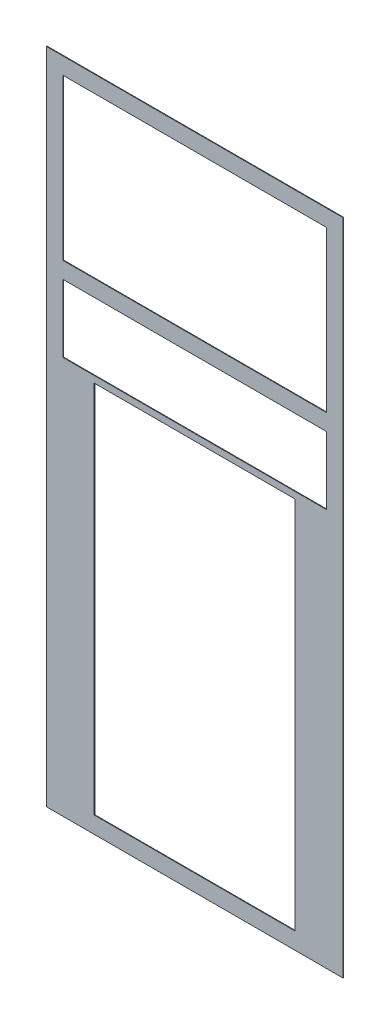
ISO-10303-21;
HEADER;
FILE_DESCRIPTION(('STEP AP214'),'2;1');
FILE_NAME('part.step','',(''),(''),'','','');
FILE_SCHEMA(('AUTOMOTIVE_DESIGN { 1 0 10303 214 1 1 1 1 }'));
ENDSEC;
DATA;
#1=APPLICATION_CONTEXT('core data for automotive mechanical design processes');
#2=APPLICATION_PROTOCOL_DEFINITION('international standard','automotive_design',2000,#1);
#3=PRODUCT_CONTEXT('',#1,'mechanical');
#4=PRODUCT('Part','Part','',(#3));
#5=PRODUCT_RELATED_PRODUCT_CATEGORY('part','',(#4));
#6=PRODUCT_DEFINITION_FORMATION('','',#4);
#7=PRODUCT_DEFINITION_CONTEXT('part definition',#1,'design');
#8=PRODUCT_DEFINITION('design','',#6,#7);
#9=PRODUCT_DEFINITION_SHAPE('','',#8);
#10=(LENGTH_UNIT() NAMED_UNIT(*) SI_UNIT(.MILLI.,.METRE.));
#11=(NAMED_UNIT(*) PLANE_ANGLE_UNIT() SI_UNIT($,.RADIAN.));
#12=(NAMED_UNIT(*) SI_UNIT($,.STERADIAN.) SOLID_ANGLE_UNIT());
#13=UNCERTAINTY_MEASURE_WITH_UNIT(LENGTH_MEASURE(1.E-05),#10,'distance_accuracy_value','');
#14=(GEOMETRIC_REPRESENTATION_CONTEXT(3) GLOBAL_UNCERTAINTY_ASSIGNED_CONTEXT((#13)) GLOBAL_UNIT_ASSIGNED_CONTEXT((#10,
#11,#12)) REPRESENTATION_CONTEXT('',''));
#15=CARTESIAN_POINT('',(0.,0.,0.));
#16=DIRECTION('',(0.,0.,1.));
#17=DIRECTION('',(1.,0.,0.));
#18=AXIS2_PLACEMENT_3D('',#15,#16,#17);
#19=CARTESIAN_POINT('',(0.,0.,1.9));
#20=DIRECTION('',(0.,0.,-1.));
#21=DIRECTION('',(-1.,0.,0.));
#22=AXIS2_PLACEMENT_3D('',#19,#20,#21);
#23=PLANE('',#22);
#24=DIRECTION('',(1.16461858888433E-12,1.,0.));
#25=VECTOR('',#24,1.);
#26=CARTESIAN_POINT('',(-50.8000000022684,5.91626243179657E-11,1.9));
#27=LINE('',#26,#25);
#28=CARTESIAN_POINT('',(-50.800000000284,1460.8,1.9));
#29=VERTEX_POINT('',#28);
#30=CARTESIAN_POINT('',(-50.8000000000007,1947.19999999995,1.9));
#31=VERTEX_POINT('',#30);
#32=EDGE_CURVE('E157',#29,#31,#27,.T.);
#33=ORIENTED_EDGE('',*,*,#32,.F.);
#34=DIRECTION('',(-1.,0.,0.));
#35=VECTOR('',#34,1.);
#36=CARTESIAN_POINT('',(-900.,1460.8,1.9));
#37=LINE('',#36,#35);
#38=CARTESIAN_POINT('',(-849.200000000284,1460.8,1.9));
#39=VERTEX_POINT('',#38);
#40=EDGE_CURVE('E165',#29,#39,#37,.T.);
#41=ORIENTED_EDGE('',*,*,#40,.T.);
#42=DIRECTION('',(-1.1643190067051E-12,-1.,0.));
#43=VECTOR('',#42,1.);
#44=CARTESIAN_POINT('',(-849.200000002268,9.88739700496609E-10,1.9));
#45=LINE('',#44,#43);
#46=CARTESIAN_POINT('',(-849.200000000001,1947.19999999995,1.9));
#47=VERTEX_POINT('',#46);
#48=EDGE_CURVE('E150',#47,#39,#45,.T.);
#49=ORIENTED_EDGE('',*,*,#48,.F.);
#50=DIRECTION('',(-1.,0.,0.));
#51=VECTOR('',#50,1.);
#52=CARTESIAN_POINT('',(-9.20617401060893E-12,1947.19999999995,1.9));
#53=LINE('',#52,#51);
#54=EDGE_CURVE('E163',#31,#47,#53,.T.);
#55=ORIENTED_EDGE('',*,*,#54,.F.);
#56=EDGE_LOOP('',(#33,#41,#49,#55));
#57=FACE_BOUND('',#56,.T.);
#58=DIRECTION('',(0.,-1.,0.));
#59=VECTOR('',#58,1.);
#60=CARTESIAN_POINT('',(-850.,1425.8,1.9));
#61=LINE('',#60,#59);
#62=CARTESIAN_POINT('',(-850.,1410.9,1.9));
#63=VERTEX_POINT('',#62);
#64=CARTESIAN_POINT('',(-850.,1205.8,1.9));
#65=VERTEX_POINT('',#64);
#66=EDGE_CURVE('E226',#63,#65,#61,.T.);
#67=ORIENTED_EDGE('',*,*,#66,.F.);
#68=DIRECTION('',(1.,0.,0.));
#69=VECTOR('',#68,1.);
#70=CARTESIAN_POINT('',(-850.,1410.9,1.9));
#71=LINE('',#70,#69);
#72=CARTESIAN_POINT('',(-49.9999999999997,1410.9,1.9));
#73=VERTEX_POINT('',#72);
#74=EDGE_CURVE('E185',#63,#73,#71,.T.);
#75=ORIENTED_EDGE('',*,*,#74,.T.);
#76=DIRECTION('',(0.,1.,0.));
#77=VECTOR('',#76,1.);
#78=CARTESIAN_POINT('',(-49.9999999999997,1425.8,1.9));
#79=LINE('',#78,#77);
#80=CARTESIAN_POINT('',(-49.9999999999996,1205.8,1.9));
#81=VERTEX_POINT('',#80);
#82=EDGE_CURVE('E212',#81,#73,#79,.T.);
#83=ORIENTED_EDGE('',*,*,#82,.F.);
#84=DIRECTION('',(1.,0.,0.));
#85=VECTOR('',#84,1.);
#86=CARTESIAN_POINT('',(-850.,1205.8,1.9));
#87=LINE('',#86,#85);
#88=EDGE_CURVE('E219',#65,#81,#87,.T.);
#89=ORIENTED_EDGE('',*,*,#88,.F.);
#90=EDGE_LOOP('',(#67,#75,#83,#89));
#91=FACE_BOUND('',#90,.T.);
#92=DIRECTION('',(0.,1.,0.));
#93=VECTOR('',#92,1.);
#94=CARTESIAN_POINT('',(-1.11022302462516E-13,1190.8,1.9));
#95=LINE('',#94,#93);
#96=CARTESIAN_POINT('',(0.,0.,1.9));
#97=VERTEX_POINT('',#96);
#98=CARTESIAN_POINT('',(-4.99600362136823E-13,1997.99999999995,1.9));
#99=VERTEX_POINT('',#98);
#100=EDGE_CURVE('E256',#97,#99,#95,.T.);
#101=ORIENTED_EDGE('',*,*,#100,.T.);
#102=DIRECTION('',(1.,0.,0.));
#103=VECTOR('',#102,1.);
#104=CARTESIAN_POINT('',(-5.12656583850879E-11,1997.99999999995,1.9));
#105=LINE('',#104,#103);
#106=CARTESIAN_POINT('',(-900.000000000036,1997.99999999993,1.9));
#107=VERTEX_POINT('',#106);
#108=EDGE_CURVE('E166',#107,#99,#105,.T.);
#109=ORIENTED_EDGE('',*,*,#108,.F.);
#110=DIRECTION('',(0.,-1.,0.));
#111=VECTOR('',#110,1.);
#112=CARTESIAN_POINT('',(-900.,-1.11022302462516E-13,1.9));
#113=LINE('',#112,#111);
#114=CARTESIAN_POINT('',(-900.,-1.11022302462516E-13,1.9));
#115=VERTEX_POINT('',#114);
#116=EDGE_CURVE('E258',#107,#115,#113,.T.);
#117=ORIENTED_EDGE('',*,*,#116,.T.);
#118=DIRECTION('',(1.,0.,0.));
#119=VECTOR('',#118,1.);
#120=CARTESIAN_POINT('',(0.,0.,1.9));
#121=LINE('',#120,#119);
#122=EDGE_CURVE('E261',#115,#97,#121,.T.);
#123=ORIENTED_EDGE('',*,*,#122,.T.);
#124=EDGE_LOOP('',(#101,#109,#117,#123));
#125=FACE_BOUND('',#124,.T.);
#126=DIRECTION('',(0.,-1.,0.));
#127=VECTOR('',#126,1.);
#128=CARTESIAN_POINT('',(-755.,50.8000000000033,1.9));
#129=LINE('',#128,#127);
#130=CARTESIAN_POINT('',(-755.,1185.8,1.9));
#131=VERTEX_POINT('',#130);
#132=CARTESIAN_POINT('',(-755.,50.8000000000033,1.9));
#133=VERTEX_POINT('',#132);
#134=EDGE_CURVE('E237',#131,#133,#129,.T.);
#135=ORIENTED_EDGE('',*,*,#134,.F.);
#136=DIRECTION('',(-1.,0.,0.));
#137=VECTOR('',#136,1.);
#138=CARTESIAN_POINT('',(-755.,1185.8,1.9));
#139=LINE('',#138,#137);
#140=CARTESIAN_POINT('',(-145.,1185.8,1.9));
#141=VERTEX_POINT('',#140);
#142=EDGE_CURVE('E204',#141,#131,#139,.T.);
#143=ORIENTED_EDGE('',*,*,#142,.F.);
#144=DIRECTION('',(0.,1.,0.));
#145=VECTOR('',#144,1.);
#146=CARTESIAN_POINT('',(-145.,1170.8,1.9));
#147=LINE('',#146,#145);
#148=CARTESIAN_POINT('',(-145.,50.8000000000034,1.9));
#149=VERTEX_POINT('',#148);
#150=EDGE_CURVE('E242',#149,#141,#147,.T.);
#151=ORIENTED_EDGE('',*,*,#150,.F.);
#152=DIRECTION('',(1.,0.,0.));
#153=VECTOR('',#152,1.);
#154=CARTESIAN_POINT('',(-145.,50.8000000000034,1.9));
#155=LINE('',#154,#153);
#156=EDGE_CURVE('E239',#133,#149,#155,.T.);
#157=ORIENTED_EDGE('',*,*,#156,.F.);
#158=EDGE_LOOP('',(#135,#143,#151,#157));
#159=FACE_BOUND('',#158,.T.);
#160=ADVANCED_FACE('F36',(#57,#91,#125,#159),#23,.F.);
#161=CARTESIAN_POINT('',(0.,0.,0.));
#162=DIRECTION('',(0.,0.,-1.));
#163=DIRECTION('',(-1.,0.,0.));
#164=AXIS2_PLACEMENT_3D('',#161,#162,#163);
#165=PLANE('',#164);
#166=DIRECTION('',(-1.,0.,0.));
#167=VECTOR('',#166,1.);
#168=CARTESIAN_POINT('',(-900.,1460.8,0.));
#169=LINE('',#168,#167);
#170=CARTESIAN_POINT('',(-50.8000000005671,1460.8,0.));
#171=VERTEX_POINT('',#170);
#172=CARTESIAN_POINT('',(-849.200000000142,1460.8,0.));
#173=VERTEX_POINT('',#172);
#174=EDGE_CURVE('E51',#171,#173,#169,.T.);
#175=ORIENTED_EDGE('',*,*,#174,.F.);
#176=DIRECTION('',(1.16461858888433E-12,1.,0.));
#177=VECTOR('',#176,1.);
#178=CARTESIAN_POINT('',(-50.8000000022684,5.91626243179657E-11,0.));
#179=LINE('',#178,#177);
#180=CARTESIAN_POINT('',(-50.8000000000007,1947.19999999995,0.));
#181=VERTEX_POINT('',#180);
#182=EDGE_CURVE('E170',#171,#181,#179,.T.);
#183=ORIENTED_EDGE('',*,*,#182,.T.);
#184=DIRECTION('',(-1.,0.,0.));
#185=VECTOR('',#184,1.);
#186=CARTESIAN_POINT('',(-9.20617401060893E-12,1947.19999999995,0.));
#187=LINE('',#186,#185);
#188=CARTESIAN_POINT('',(-849.200000000001,1947.19999999995,0.));
#189=VERTEX_POINT('',#188);
#190=EDGE_CURVE('E179',#181,#189,#187,.T.);
#191=ORIENTED_EDGE('',*,*,#190,.T.);
#192=DIRECTION('',(-1.1643190067051E-12,-1.,0.));
#193=VECTOR('',#192,1.);
#194=CARTESIAN_POINT('',(-849.200000002268,9.88739700496609E-10,0.));
#195=LINE('',#194,#193);
#196=EDGE_CURVE('E152',#189,#173,#195,.T.);
#197=ORIENTED_EDGE('',*,*,#196,.T.);
#198=EDGE_LOOP('',(#175,#183,#191,#197));
#199=FACE_BOUND('',#198,.T.);
#200=DIRECTION('',(1.,0.,0.));
#201=VECTOR('',#200,1.);
#202=CARTESIAN_POINT('',(-850.,1410.9,0.));
#203=LINE('',#202,#201);
#204=CARTESIAN_POINT('',(-850.,1410.9,0.));
#205=VERTEX_POINT('',#204);
#206=CARTESIAN_POINT('',(-49.9999999999997,1410.9,0.));
#207=VERTEX_POINT('',#206);
#208=EDGE_CURVE('E195',#205,#207,#203,.T.);
#209=ORIENTED_EDGE('',*,*,#208,.F.);
#210=DIRECTION('',(0.,-1.,0.));
#211=VECTOR('',#210,1.);
#212=CARTESIAN_POINT('',(-850.,1425.8,0.));
#213=LINE('',#212,#211);
#214=CARTESIAN_POINT('',(-850.,1205.8,0.));
#215=VERTEX_POINT('',#214);
#216=EDGE_CURVE('E218',#205,#215,#213,.T.);
#217=ORIENTED_EDGE('',*,*,#216,.T.);
#218=DIRECTION('',(1.,0.,0.));
#219=VECTOR('',#218,1.);
#220=CARTESIAN_POINT('',(-850.,1205.8,0.));
#221=LINE('',#220,#219);
#222=CARTESIAN_POINT('',(-49.9999999999996,1205.8,0.));
#223=VERTEX_POINT('',#222);
#224=EDGE_CURVE('E221',#215,#223,#221,.T.);
#225=ORIENTED_EDGE('',*,*,#224,.T.);
#226=DIRECTION('',(0.,1.,0.));
#227=VECTOR('',#226,1.);
#228=CARTESIAN_POINT('',(-49.9999999999997,1425.8,0.));
#229=LINE('',#228,#227);
#230=EDGE_CURVE('E215',#223,#207,#229,.T.);
#231=ORIENTED_EDGE('',*,*,#230,.T.);
#232=EDGE_LOOP('',(#209,#217,#225,#231));
#233=FACE_BOUND('',#232,.T.);
#234=DIRECTION('',(1.,0.,0.));
#235=VECTOR('',#234,1.);
#236=CARTESIAN_POINT('',(0.,1185.8,0.));
#237=LINE('',#236,#235);
#238=CARTESIAN_POINT('',(-755.,1185.8,0.));
#239=VERTEX_POINT('',#238);
#240=CARTESIAN_POINT('',(-145.,1185.8,0.));
#241=VERTEX_POINT('',#240);
#242=EDGE_CURVE('E11',#239,#241,#237,.T.);
#243=ORIENTED_EDGE('',*,*,#242,.F.);
#244=DIRECTION('',(0.,-1.,0.));
#245=VECTOR('',#244,1.);
#246=CARTESIAN_POINT('',(-755.,50.8000000000033,0.));
#247=LINE('',#246,#245);
#248=CARTESIAN_POINT('',(-755.,50.8000000000033,0.));
#249=VERTEX_POINT('',#248);
#250=EDGE_CURVE('E235',#239,#249,#247,.T.);
#251=ORIENTED_EDGE('',*,*,#250,.T.);
#252=DIRECTION('',(1.,0.,0.));
#253=VECTOR('',#252,1.);
#254=CARTESIAN_POINT('',(-145.,50.8000000000034,0.));
#255=LINE('',#254,#253);
#256=CARTESIAN_POINT('',(-145.,50.8000000000034,0.));
#257=VERTEX_POINT('',#256);
#258=EDGE_CURVE('E247',#249,#257,#255,.T.);
#259=ORIENTED_EDGE('',*,*,#258,.T.);
#260=DIRECTION('',(0.,1.,0.));
#261=VECTOR('',#260,1.);
#262=CARTESIAN_POINT('',(-145.,1170.8,0.));
#263=LINE('',#262,#261);
#264=EDGE_CURVE('E240',#257,#241,#263,.T.);
#265=ORIENTED_EDGE('',*,*,#264,.T.);
#266=EDGE_LOOP('',(#243,#251,#259,#265));
#267=FACE_BOUND('',#266,.T.);
#268=DIRECTION('',(0.,1.,0.));
#269=VECTOR('',#268,1.);
#270=CARTESIAN_POINT('',(-1.11022302462516E-13,1190.8,0.));
#271=LINE('',#270,#269);
#272=CARTESIAN_POINT('',(0.,0.,0.));
#273=VERTEX_POINT('',#272);
#274=CARTESIAN_POINT('',(-4.99600362136823E-13,1997.99999999995,0.));
#275=VERTEX_POINT('',#274);
#276=EDGE_CURVE('E255',#273,#275,#271,.T.);
#277=ORIENTED_EDGE('',*,*,#276,.F.);
#278=DIRECTION('',(1.,0.,0.));
#279=VECTOR('',#278,1.);
#280=CARTESIAN_POINT('',(0.,0.,0.));
#281=LINE('',#280,#279);
#282=CARTESIAN_POINT('',(-900.,-1.11022302462516E-13,0.));
#283=VERTEX_POINT('',#282);
#284=EDGE_CURVE('E259',#283,#273,#281,.T.);
#285=ORIENTED_EDGE('',*,*,#284,.F.);
#286=DIRECTION('',(0.,-1.,0.));
#287=VECTOR('',#286,1.);
#288=CARTESIAN_POINT('',(-900.,-1.11022302462516E-13,0.));
#289=LINE('',#288,#287);
#290=CARTESIAN_POINT('',(-900.000000000036,1997.99999999993,0.));
#291=VERTEX_POINT('',#290);
#292=EDGE_CURVE('E265',#291,#283,#289,.T.);
#293=ORIENTED_EDGE('',*,*,#292,.F.);
#294=DIRECTION('',(1.,0.,0.));
#295=VECTOR('',#294,1.);
#296=CARTESIAN_POINT('',(-5.12656583850879E-11,1997.99999999995,0.));
#297=LINE('',#296,#295);
#298=EDGE_CURVE('E173',#291,#275,#297,.T.);
#299=ORIENTED_EDGE('',*,*,#298,.T.);
#300=EDGE_LOOP('',(#277,#285,#293,#299));
#301=FACE_BOUND('',#300,.T.);
#302=ADVANCED_FACE('F279',(#199,#233,#267,#301),#165,.T.);
#303=CARTESIAN_POINT('',(-1.11022302462516E-13,1190.8,1.9));
#304=DIRECTION('',(-1.,0.,0.));
#305=DIRECTION('',(0.,-1.,0.));
#306=AXIS2_PLACEMENT_3D('',#303,#304,#305);
#307=PLANE('',#306);
#308=ORIENTED_EDGE('',*,*,#276,.T.);
#309=DIRECTION('',(0.,0.,-1.));
#310=VECTOR('',#309,1.);
#311=CARTESIAN_POINT('',(-4.99600362136823E-13,1997.99999999995,1.9));
#312=LINE('',#311,#310);
#313=EDGE_CURVE('E188',#99,#275,#312,.T.);
#314=ORIENTED_EDGE('',*,*,#313,.F.);
#315=ORIENTED_EDGE('',*,*,#100,.F.);
#316=DIRECTION('',(0.,0.,-1.));
#317=VECTOR('',#316,1.);
#318=CARTESIAN_POINT('',(0.,0.,1.9));
#319=LINE('',#318,#317);
#320=EDGE_CURVE('E263',#97,#273,#319,.T.);
#321=ORIENTED_EDGE('',*,*,#320,.T.);
#322=EDGE_LOOP('',(#308,#314,#315,#321));
#323=FACE_BOUND('',#322,.T.);
#324=ADVANCED_FACE('F38',(#323),#307,.F.);
#325=CARTESIAN_POINT('',(-900.,-1.11022302462516E-13,1.9));
#326=DIRECTION('',(1.,0.,0.));
#327=DIRECTION('',(0.,0.,-1.));
#328=AXIS2_PLACEMENT_3D('',#325,#326,#327);
#329=PLANE('',#328);
#330=ORIENTED_EDGE('',*,*,#292,.T.);
#331=DIRECTION('',(0.,0.,-1.));
#332=VECTOR('',#331,1.);
#333=CARTESIAN_POINT('',(-900.,-1.11022302462516E-13,1.9));
#334=LINE('',#333,#332);
#335=EDGE_CURVE('E44',#115,#283,#334,.T.);
#336=ORIENTED_EDGE('',*,*,#335,.F.);
#337=ORIENTED_EDGE('',*,*,#116,.F.);
#338=DIRECTION('',(0.,0.,-1.));
#339=VECTOR('',#338,1.);
#340=CARTESIAN_POINT('',(-900.000000000036,1997.99999999993,1.9));
#341=LINE('',#340,#339);
#342=EDGE_CURVE('E191',#107,#291,#341,.T.);
#343=ORIENTED_EDGE('',*,*,#342,.T.);
#344=EDGE_LOOP('',(#330,#336,#337,#343));
#345=FACE_BOUND('',#344,.T.);
#346=ADVANCED_FACE('F290',(#345),#329,.F.);
#347=CARTESIAN_POINT('',(0.,0.,1.9));
#348=DIRECTION('',(0.,1.,0.));
#349=DIRECTION('',(-1.,0.,0.));
#350=AXIS2_PLACEMENT_3D('',#347,#348,#349);
#351=PLANE('',#350);
#352=ORIENTED_EDGE('',*,*,#284,.T.);
#353=ORIENTED_EDGE('',*,*,#320,.F.);
#354=ORIENTED_EDGE('',*,*,#122,.F.);
#355=ORIENTED_EDGE('',*,*,#335,.T.);
#356=EDGE_LOOP('',(#352,#353,#354,#355));
#357=FACE_BOUND('',#356,.T.);
#358=ADVANCED_FACE('F274',(#357),#351,.F.);
#359=CARTESIAN_POINT('',(-755.,50.8000000000033,1.9));
#360=DIRECTION('',(1.,0.,0.));
#361=DIRECTION('',(0.,0.,-1.));
#362=AXIS2_PLACEMENT_3D('',#359,#360,#361);
#363=PLANE('',#362);
#364=ORIENTED_EDGE('',*,*,#250,.F.);
#365=DIRECTION('',(0.,0.,1.));
#366=VECTOR('',#365,1.);
#367=CARTESIAN_POINT('',(-755.,1185.8,-8.1));
#368=LINE('',#367,#366);
#369=EDGE_CURVE('E209',#239,#131,#368,.T.);
#370=ORIENTED_EDGE('',*,*,#369,.T.);
#371=ORIENTED_EDGE('',*,*,#134,.T.);
#372=DIRECTION('',(0.,0.,-1.));
#373=VECTOR('',#372,1.);
#374=CARTESIAN_POINT('',(-755.,50.8000000000033,1.9));
#375=LINE('',#374,#373);
#376=EDGE_CURVE('E252',#133,#249,#375,.T.);
#377=ORIENTED_EDGE('',*,*,#376,.T.);
#378=EDGE_LOOP('',(#364,#370,#371,#377));
#379=FACE_BOUND('',#378,.T.);
#380=ADVANCED_FACE('F296',(#379),#363,.T.);
#381=CARTESIAN_POINT('',(-145.,50.8000000000034,1.9));
#382=DIRECTION('',(0.,1.,0.));
#383=DIRECTION('',(-1.,0.,0.));
#384=AXIS2_PLACEMENT_3D('',#381,#382,#383);
#385=PLANE('',#384);
#386=ORIENTED_EDGE('',*,*,#258,.F.);
#387=ORIENTED_EDGE('',*,*,#376,.F.);
#388=ORIENTED_EDGE('',*,*,#156,.T.);
#389=DIRECTION('',(0.,0.,-1.));
#390=VECTOR('',#389,1.);
#391=CARTESIAN_POINT('',(-145.,50.8000000000034,1.9));
#392=LINE('',#391,#390);
#393=EDGE_CURVE('E244',#149,#257,#392,.T.);
#394=ORIENTED_EDGE('',*,*,#393,.T.);
#395=EDGE_LOOP('',(#386,#387,#388,#394));
#396=FACE_BOUND('',#395,.T.);
#397=ADVANCED_FACE('F308',(#396),#385,.T.);
#398=CARTESIAN_POINT('',(-145.,1170.8,1.9));
#399=DIRECTION('',(-1.,0.,0.));
#400=DIRECTION('',(0.,-1.,0.));
#401=AXIS2_PLACEMENT_3D('',#398,#399,#400);
#402=PLANE('',#401);
#403=ORIENTED_EDGE('',*,*,#264,.F.);
#404=ORIENTED_EDGE('',*,*,#393,.F.);
#405=ORIENTED_EDGE('',*,*,#150,.T.);
#406=DIRECTION('',(0.,0.,1.));
#407=VECTOR('',#406,1.);
#408=CARTESIAN_POINT('',(-145.,1185.8,-8.1));
#409=LINE('',#408,#407);
#410=EDGE_CURVE('E208',#241,#141,#409,.T.);
#411=ORIENTED_EDGE('',*,*,#410,.F.);
#412=EDGE_LOOP('',(#403,#404,#405,#411));
#413=FACE_BOUND('',#412,.T.);
#414=ADVANCED_FACE('F312',(#413),#402,.T.);
#415=CARTESIAN_POINT('',(-900.,1460.8,0.));
#416=DIRECTION('',(0.,1.,0.));
#417=DIRECTION('',(0.,0.,1.));
#418=AXIS2_PLACEMENT_3D('',#415,#416,#417);
#419=PLANE('',#418);
#420=DIRECTION('',(0.,0.,-1.));
#421=VECTOR('',#420,1.);
#422=CARTESIAN_POINT('',(-50.8000000005671,1460.8,1.9));
#423=LINE('',#422,#421);
#424=EDGE_CURVE('E186',#29,#171,#423,.T.);
#425=ORIENTED_EDGE('',*,*,#424,.T.);
#426=ORIENTED_EDGE('',*,*,#174,.T.);
#427=DIRECTION('',(0.,0.,-1.));
#428=VECTOR('',#427,1.);
#429=CARTESIAN_POINT('',(-849.200000000284,1460.8,1.9));
#430=LINE('',#429,#428);
#431=EDGE_CURVE('E55',#39,#173,#430,.T.);
#432=ORIENTED_EDGE('',*,*,#431,.F.);
#433=ORIENTED_EDGE('',*,*,#40,.F.);
#434=EDGE_LOOP('',(#425,#426,#432,#433));
#435=FACE_BOUND('',#434,.T.);
#436=ADVANCED_FACE('F316',(#435),#419,.T.);
#437=CARTESIAN_POINT('',(-49.9999999999997,1425.8,0.));
#438=DIRECTION('',(1.,0.,0.));
#439=DIRECTION('',(0.,1.,0.));
#440=AXIS2_PLACEMENT_3D('',#437,#438,#439);
#441=PLANE('',#440);
#442=ORIENTED_EDGE('',*,*,#82,.T.);
#443=DIRECTION('',(0.,0.,1.));
#444=VECTOR('',#443,1.);
#445=CARTESIAN_POINT('',(-49.9999999999996,1410.9,0.));
#446=LINE('',#445,#444);
#447=EDGE_CURVE('E201',#207,#73,#446,.T.);
#448=ORIENTED_EDGE('',*,*,#447,.F.);
#449=ORIENTED_EDGE('',*,*,#230,.F.);
#450=DIRECTION('',(0.,0.,1.));
#451=VECTOR('',#450,1.);
#452=CARTESIAN_POINT('',(-49.9999999999996,1205.8,0.));
#453=LINE('',#452,#451);
#454=EDGE_CURVE('E230',#223,#81,#453,.T.);
#455=ORIENTED_EDGE('',*,*,#454,.T.);
#456=EDGE_LOOP('',(#442,#448,#449,#455));
#457=FACE_BOUND('',#456,.T.);
#458=ADVANCED_FACE('F320',(#457),#441,.F.);
#459=CARTESIAN_POINT('',(-850.,1205.8,0.));
#460=DIRECTION('',(0.,-1.,0.));
#461=DIRECTION('',(0.,0.,-1.));
#462=AXIS2_PLACEMENT_3D('',#459,#460,#461);
#463=PLANE('',#462);
#464=ORIENTED_EDGE('',*,*,#88,.T.);
#465=ORIENTED_EDGE('',*,*,#454,.F.);
#466=ORIENTED_EDGE('',*,*,#224,.F.);
#467=DIRECTION('',(0.,0.,1.));
#468=VECTOR('',#467,1.);
#469=CARTESIAN_POINT('',(-850.,1205.8,0.));
#470=LINE('',#469,#468);
#471=EDGE_CURVE('E224',#215,#65,#470,.T.);
#472=ORIENTED_EDGE('',*,*,#471,.T.);
#473=EDGE_LOOP('',(#464,#465,#466,#472));
#474=FACE_BOUND('',#473,.T.);
#475=ADVANCED_FACE('F323',(#474),#463,.F.);
#476=CARTESIAN_POINT('',(-850.,1425.8,0.));
#477=DIRECTION('',(-1.,0.,0.));
#478=DIRECTION('',(0.,0.,1.));
#479=AXIS2_PLACEMENT_3D('',#476,#477,#478);
#480=PLANE('',#479);
#481=ORIENTED_EDGE('',*,*,#216,.F.);
#482=DIRECTION('',(0.,0.,1.));
#483=VECTOR('',#482,1.);
#484=CARTESIAN_POINT('',(-850.,1410.9,0.));
#485=LINE('',#484,#483);
#486=EDGE_CURVE('E198',#205,#63,#485,.T.);
#487=ORIENTED_EDGE('',*,*,#486,.T.);
#488=ORIENTED_EDGE('',*,*,#66,.T.);
#489=ORIENTED_EDGE('',*,*,#471,.F.);
#490=EDGE_LOOP('',(#481,#487,#488,#489));
#491=FACE_BOUND('',#490,.T.);
#492=ADVANCED_FACE('F325',(#491),#480,.F.);
#493=CARTESIAN_POINT('',(-755.,1185.8,-8.1));
#494=DIRECTION('',(0.,1.,0.));
#495=DIRECTION('',(0.,0.,1.));
#496=AXIS2_PLACEMENT_3D('',#493,#494,#495);
#497=PLANE('',#496);
#498=ORIENTED_EDGE('',*,*,#242,.T.);
#499=ORIENTED_EDGE('',*,*,#410,.T.);
#500=ORIENTED_EDGE('',*,*,#142,.T.);
#501=ORIENTED_EDGE('',*,*,#369,.F.);
#502=EDGE_LOOP('',(#498,#499,#500,#501));
#503=FACE_BOUND('',#502,.T.);
#504=ADVANCED_FACE('F328',(#503),#497,.F.);
#505=CARTESIAN_POINT('',(-850.,1410.9,0.));
#506=DIRECTION('',(0.,-1.,0.));
#507=DIRECTION('',(0.,0.,-1.));
#508=AXIS2_PLACEMENT_3D('',#505,#506,#507);
#509=PLANE('',#508);
#510=ORIENTED_EDGE('',*,*,#74,.F.);
#511=ORIENTED_EDGE('',*,*,#486,.F.);
#512=ORIENTED_EDGE('',*,*,#208,.T.);
#513=ORIENTED_EDGE('',*,*,#447,.T.);
#514=EDGE_LOOP('',(#510,#511,#512,#513));
#515=FACE_BOUND('',#514,.T.);
#516=ADVANCED_FACE('F335',(#515),#509,.T.);
#517=CARTESIAN_POINT('',(-9.20617401060893E-12,1947.19999999995,1.9));
#518=DIRECTION('',(0.,-1.,0.));
#519=DIRECTION('',(1.,0.,0.));
#520=AXIS2_PLACEMENT_3D('',#517,#518,#519);
#521=PLANE('',#520);
#522=ORIENTED_EDGE('',*,*,#190,.F.);
#523=DIRECTION('',(0.,0.,-1.));
#524=VECTOR('',#523,1.);
#525=CARTESIAN_POINT('',(-50.8000000000007,1947.19999999995,1.9));
#526=LINE('',#525,#524);
#527=EDGE_CURVE('E169',#31,#181,#526,.T.);
#528=ORIENTED_EDGE('',*,*,#527,.F.);
#529=ORIENTED_EDGE('',*,*,#54,.T.);
#530=DIRECTION('',(0.,0.,-1.));
#531=VECTOR('',#530,1.);
#532=CARTESIAN_POINT('',(-849.200000000001,1947.19999999995,1.9));
#533=LINE('',#532,#531);
#534=EDGE_CURVE('E147',#47,#189,#533,.T.);
#535=ORIENTED_EDGE('',*,*,#534,.T.);
#536=EDGE_LOOP('',(#522,#528,#529,#535));
#537=FACE_BOUND('',#536,.T.);
#538=ADVANCED_FACE('F168',(#537),#521,.T.);
#539=CARTESIAN_POINT('',(-50.8000000022684,5.91626243179657E-11,1.9));
#540=DIRECTION('',(-1.,1.16461858888433E-12,0.));
#541=DIRECTION('',(-1.16461858888433E-12,-1.,0.));
#542=AXIS2_PLACEMENT_3D('',#539,#540,#541);
#543=PLANE('',#542);
#544=ORIENTED_EDGE('',*,*,#182,.F.);
#545=ORIENTED_EDGE('',*,*,#424,.F.);
#546=ORIENTED_EDGE('',*,*,#32,.T.);
#547=ORIENTED_EDGE('',*,*,#527,.T.);
#548=EDGE_LOOP('',(#544,#545,#546,#547));
#549=FACE_BOUND('',#548,.T.);
#550=ADVANCED_FACE('F342',(#549),#543,.T.);
#551=CARTESIAN_POINT('',(-5.12656583850879E-11,1997.99999999995,1.9));
#552=DIRECTION('',(0.,1.,0.));
#553=DIRECTION('',(-1.,0.,0.));
#554=AXIS2_PLACEMENT_3D('',#551,#552,#553);
#555=PLANE('',#554);
#556=ORIENTED_EDGE('',*,*,#298,.F.);
#557=ORIENTED_EDGE('',*,*,#342,.F.);
#558=ORIENTED_EDGE('',*,*,#108,.T.);
#559=ORIENTED_EDGE('',*,*,#313,.T.);
#560=EDGE_LOOP('',(#556,#557,#558,#559));
#561=FACE_BOUND('',#560,.T.);
#562=ADVANCED_FACE('F285',(#561),#555,.T.);
#563=CARTESIAN_POINT('',(-849.200000002268,9.88739700496609E-10,1.9));
#564=DIRECTION('',(1.,-1.1643190067051E-12,0.));
#565=DIRECTION('',(1.1643190067051E-12,1.,0.));
#566=AXIS2_PLACEMENT_3D('',#563,#564,#565);
#567=PLANE('',#566);
#568=ORIENTED_EDGE('',*,*,#196,.F.);
#569=ORIENTED_EDGE('',*,*,#534,.F.);
#570=ORIENTED_EDGE('',*,*,#48,.T.);
#571=ORIENTED_EDGE('',*,*,#431,.T.);
#572=EDGE_LOOP('',(#568,#569,#570,#571));
#573=FACE_BOUND('',#572,.T.);
#574=ADVANCED_FACE('F149',(#573),#567,.T.);
#575=CLOSED_SHELL('',(#160,#302,#324,#346,#358,#380,#397,#414,#436,#458,#475,#492,#504,#516,
#538,#550,#562,#574));
#576=MANIFOLD_SOLID_BREP('B2',#575);
#577=ADVANCED_BREP_SHAPE_REPRESENTATION('',(#18,#576),#14);
#578=SHAPE_DEFINITION_REPRESENTATION(#9,#577);
ENDSEC;
END-ISO-10303-21;
